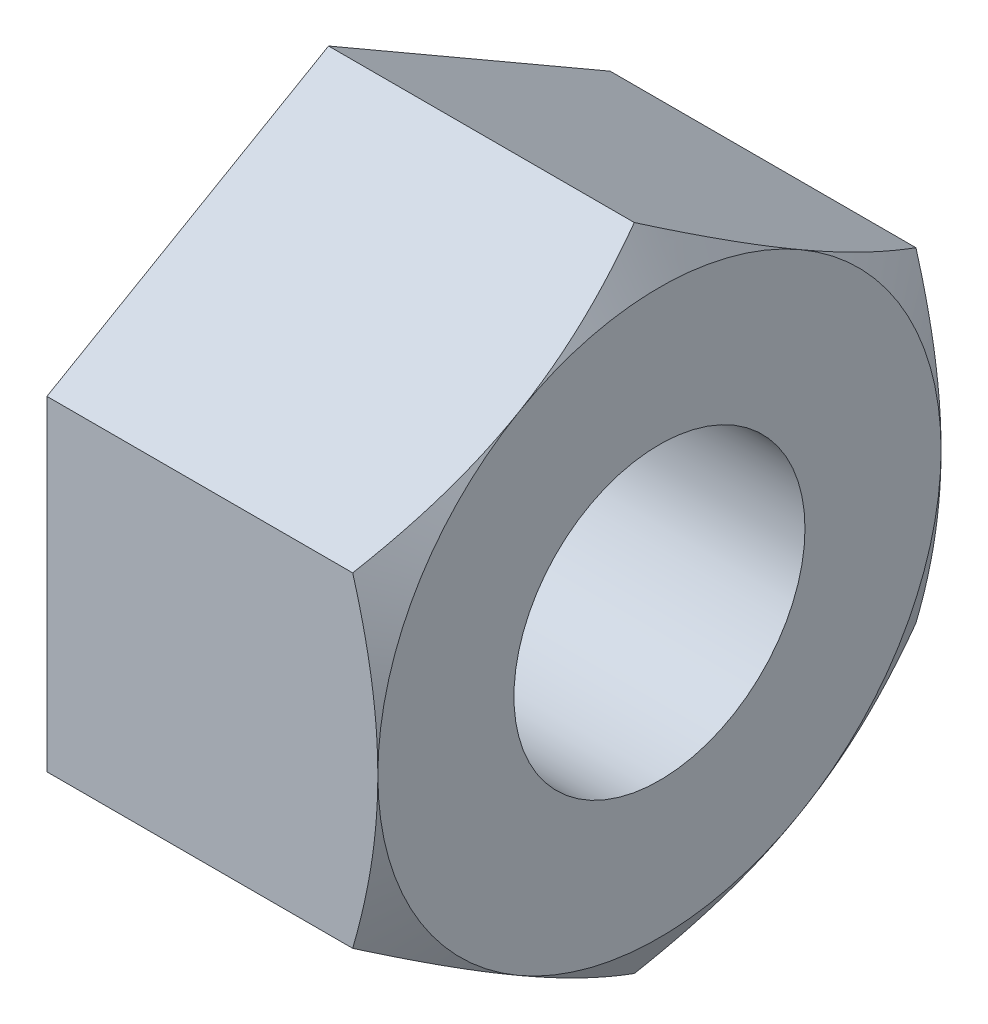
ISO-10303-21;
HEADER;
FILE_DESCRIPTION(('STEP AP214'),'2;1');
FILE_NAME('part.step','',(''),(''),'','','');
FILE_SCHEMA(('AUTOMOTIVE_DESIGN { 1 0 10303 214 1 1 1 1 }'));
ENDSEC;
DATA;
#1=APPLICATION_CONTEXT('core data for automotive mechanical design processes');
#2=APPLICATION_PROTOCOL_DEFINITION('international standard','automotive_design',2000,#1);
#3=PRODUCT_CONTEXT('',#1,'mechanical');
#4=PRODUCT('Part','Part','',(#3));
#5=PRODUCT_RELATED_PRODUCT_CATEGORY('part','',(#4));
#6=PRODUCT_DEFINITION_FORMATION('','',#4);
#7=PRODUCT_DEFINITION_CONTEXT('part definition',#1,'design');
#8=PRODUCT_DEFINITION('design','',#6,#7);
#9=PRODUCT_DEFINITION_SHAPE('','',#8);
#10=(LENGTH_UNIT() NAMED_UNIT(*) SI_UNIT(.MILLI.,.METRE.));
#11=(NAMED_UNIT(*) PLANE_ANGLE_UNIT() SI_UNIT($,.RADIAN.));
#12=(NAMED_UNIT(*) SI_UNIT($,.STERADIAN.) SOLID_ANGLE_UNIT());
#13=UNCERTAINTY_MEASURE_WITH_UNIT(LENGTH_MEASURE(1.E-05),#10,'distance_accuracy_value','');
#14=(GEOMETRIC_REPRESENTATION_CONTEXT(3) GLOBAL_UNCERTAINTY_ASSIGNED_CONTEXT((#13)) GLOBAL_UNIT_ASSIGNED_CONTEXT((#10,
#11,#12)) REPRESENTATION_CONTEXT('',''));
#15=CARTESIAN_POINT('',(0.,0.,0.));
#16=DIRECTION('',(0.,0.,1.));
#17=DIRECTION('',(1.,0.,0.));
#18=AXIS2_PLACEMENT_3D('',#15,#16,#17);
#19=CARTESIAN_POINT('',(-4.7,2.30940107675851,-4.));
#20=DIRECTION('',(0.,0.866025403784439,-0.5));
#21=DIRECTION('',(0.,0.5,0.866025403784439));
#22=AXIS2_PLACEMENT_3D('',#19,#20,#21);
#23=PLANE('',#22);
#24=DIRECTION('',(1.,0.,0.));
#25=VECTOR('',#24,1.);
#26=CARTESIAN_POINT('',(-4.7,4.61880215351701,0.));
#27=LINE('',#26,#25);
#28=CARTESIAN_POINT('',(-4.7,4.61880215351701,0.));
#29=VERTEX_POINT('',#28);
#30=CARTESIAN_POINT('',(-0.35726558990816,4.61880215351701,0.));
#31=VERTEX_POINT('',#30);
#32=EDGE_CURVE('E213',#29,#31,#27,.T.);
#33=ORIENTED_EDGE('',*,*,#32,.T.);
#34=CARTESIAN_POINT('',(-0.357332259074764,4.61891762357085,0.000199999999999586));
#35=CARTESIAN_POINT('',(-0.298717873648281,4.51743148381381,-0.175579150323228));
#36=CARTESIAN_POINT('',(-0.245410321462261,4.41506932144052,-0.352875616326381));
#37=CARTESIAN_POINT('',(-0.152361670746403,4.2085725054774,-0.710538593175706));
#38=CARTESIAN_POINT('',(-0.112653489029704,4.10443418285647,-0.890911458970151));
#39=CARTESIAN_POINT('',(-0.0508422152802794,3.89744813015756,-1.24942181870279));
#40=CARTESIAN_POINT('',(-0.0283277315228894,3.7946322465506,-1.42750415293514));
#41=CARTESIAN_POINT('',(-0.00145062314658247,3.58851671999023,-1.78450671716651));
#42=CARTESIAN_POINT('',(0.00293425857305625,3.48521782616117,-1.9634256496441));
#43=CARTESIAN_POINT('',(-0.00619007293997059,3.29219970504619,-2.29774284219673));
#44=CARTESIAN_POINT('',(-0.0174589539879945,3.20245157692487,-2.45319115998707));
#45=CARTESIAN_POINT('',(-0.0531739907981929,3.02354002635497,-2.76307505563505));
#46=CARTESIAN_POINT('',(-0.0776323457115324,2.93437722268073,-2.91750956174413));
#47=CARTESIAN_POINT('',(-0.138776064919288,2.75509682012354,-3.22803232777458));
#48=CARTESIAN_POINT('',(-0.175720603654862,2.6650019108942,-3.3840812880631));
#49=CARTESIAN_POINT('',(-0.259570072548025,2.48615580200001,-3.69385183540384));
#50=CARTESIAN_POINT('',(-0.306455302212737,2.39740231122585,-3.84757739077378));
#51=CARTESIAN_POINT('',(-0.357332259074764,2.30928560670467,-4.0002));
#52=B_SPLINE_CURVE_WITH_KNOTS('',3,(#34,#35,#36,#37,#38,#39,#40,#41,#42,#43,#44,#45,#46,#47,#48,
#49,#50,#51),.UNSPECIFIED.,.F.,.F.,(4,2,2,2,2,2,2,2,4),(0.,0.634047835695965,1.26961969224543,
1.88946157213122,2.50854226669297,3.04757825393385,3.58711366126903,4.13861653143764,
4.68903648037743),.UNSPECIFIED.);
#53=CARTESIAN_POINT('',(0.,3.46410161513775,-2.));
#54=VERTEX_POINT('',#53);
#55=EDGE_CURVE('E58',#31,#54,#52,.T.);
#56=ORIENTED_EDGE('',*,*,#55,.T.);
#57=CARTESIAN_POINT('',(-0.35726558990816,2.30940107675851,-4.));
#58=VERTEX_POINT('',#57);
#59=EDGE_CURVE('E185',#54,#58,#52,.T.);
#60=ORIENTED_EDGE('',*,*,#59,.T.);
#61=DIRECTION('',(1.,0.,0.));
#62=VECTOR('',#61,1.);
#63=CARTESIAN_POINT('',(-4.7,2.30940107675851,-4.));
#64=LINE('',#63,#62);
#65=CARTESIAN_POINT('',(-4.7,2.30940107675851,-4.));
#66=VERTEX_POINT('',#65);
#67=EDGE_CURVE('E233',#66,#58,#64,.T.);
#68=ORIENTED_EDGE('',*,*,#67,.F.);
#69=DIRECTION('',(0.,0.5,0.866025403784439));
#70=VECTOR('',#69,1.);
#71=CARTESIAN_POINT('',(-4.7,2.30940107675851,-4.));
#72=LINE('',#71,#70);
#73=EDGE_CURVE('E216',#66,#29,#72,.T.);
#74=ORIENTED_EDGE('',*,*,#73,.T.);
#75=EDGE_LOOP('',(#33,#56,#60,#68,#74));
#76=FACE_BOUND('',#75,.T.);
#77=ADVANCED_FACE('F36',(#76),#23,.T.);
#78=CARTESIAN_POINT('',(-4.7,-2.3094010767585,-4.));
#79=DIRECTION('',(0.,0.,-1.));
#80=DIRECTION('',(-1.,0.,0.));
#81=AXIS2_PLACEMENT_3D('',#78,#79,#80);
#82=PLANE('',#81);
#83=ORIENTED_EDGE('',*,*,#67,.T.);
#84=CARTESIAN_POINT('',(-1.91410682124061,-6.12487198995892,-4.));
#85=CARTESIAN_POINT('',(-1.82923627076687,-5.94924937038676,-4.));
#86=CARTESIAN_POINT('',(-1.74520940380737,-5.77321152095286,-4.));
#87=CARTESIAN_POINT('',(-1.57932514679714,-5.42008084777954,-4.));
#88=CARTESIAN_POINT('',(-1.49746813236721,-5.24298784779927,-4.));
#89=CARTESIAN_POINT('',(-1.33597446305854,-4.88656571686333,-4.));
#90=CARTESIAN_POINT('',(-1.25635319506302,-4.70722958889362,-4.));
#91=CARTESIAN_POINT('',(-1.10053058542028,-4.34708334747263,-4.));
#92=CARTESIAN_POINT('',(-1.024329065508,-4.16627331143537,-4.));
#93=CARTESIAN_POINT('',(-0.875350650394347,-3.80064706744977,-4.));
#94=CARTESIAN_POINT('',(-0.802627284215832,-3.61580892822769,-4.));
#95=CARTESIAN_POINT('',(-0.662876230959408,-3.24395246794968,-4.));
#96=CARTESIAN_POINT('',(-0.595849177566493,-3.05693390695801,-4.));
#97=CARTESIAN_POINT('',(-0.469291748430873,-2.6808031825377,-4.));
#98=CARTESIAN_POINT('',(-0.40974543478383,-2.49169643712848,-4.));
#99=CARTESIAN_POINT('',(-0.300083356544501,-2.11079454635851,-4.));
#100=CARTESIAN_POINT('',(-0.249964609676747,-1.91900027185748,-4.));
#101=CARTESIAN_POINT('',(-0.161590794954039,-1.532592326982,-4.));
#102=CARTESIAN_POINT('',(-0.123338885956538,-1.33797792031649,-4.));
#103=CARTESIAN_POINT('',(-0.0612742359223421,-0.946402725872551,-4.));
#104=CARTESIAN_POINT('',(-0.037461507651698,-0.749441936019772,-4.));
#105=CARTESIAN_POINT('',(-0.00638181314943593,-0.355451989627941,-4.));
#106=CARTESIAN_POINT('',(0.000989900761041437,-0.15843131109401,-4.));
#107=CARTESIAN_POINT('',(-0.00120406637479564,0.235472085607468,-4.));
#108=CARTESIAN_POINT('',(-0.0107653508153506,0.432354826312204,-4.));
#109=CARTESIAN_POINT('',(-0.0408787346135902,0.768560635225518,-4.));
#110=CARTESIAN_POINT('',(-0.0575092960439092,0.908254618381823,-4.));
#111=CARTESIAN_POINT('',(-0.0982134103466918,1.18656349063498,-4.));
#112=CARTESIAN_POINT('',(-0.122288137058447,1.32517820601014,-4.));
#113=CARTESIAN_POINT('',(-0.204415070950233,1.73929045452971,-4.));
#114=CARTESIAN_POINT('',(-0.272348886425156,2.01284690528725,-4.));
#115=CARTESIAN_POINT('',(-0.389516359317208,2.42218253014527,-4.));
#116=CARTESIAN_POINT('',(-0.431713941811642,2.56009536361542,-4.));
#117=CARTESIAN_POINT('',(-0.520284580227769,2.83448159101408,-4.));
#118=CARTESIAN_POINT('',(-0.56665475618692,2.97095590623562,-4.));
#119=CARTESIAN_POINT('',(-0.662605699180295,3.24189440516346,-4.));
#120=CARTESIAN_POINT('',(-0.71216692575351,3.37636557946843,-4.));
#121=CARTESIAN_POINT('',(-0.814198353790713,3.6442646115292,-4.));
#122=CARTESIAN_POINT('',(-0.866669730963381,3.77769202239393,-4.));
#123=CARTESIAN_POINT('',(-0.920309006541805,3.9106369898669,-4.));
#124=B_SPLINE_CURVE_WITH_KNOTS('',3,(#84,#85,#86,#87,#88,#89,#90,#91,#92,#93,#94,#95,#96,#97,
#98,#99,#100,#101,#102,#103,#104,#105,#106,#107,#108,#109,#110,#111,#112,#113,#114,#115,#116,
#117,#118,#119,#120,#121,#122,#123),.UNSPECIFIED.,.F.,.F.,(4,2,2,2,2,2,2,2,2,2,2,2,2,2,2,2,2,2,
2,4),(0.,0.585171792532269,1.17044423059926,1.75906594645989,2.34765694284826,2.94347400997483,
3.53935727210688,4.13394864697599,4.7283516139147,5.32291267067844,5.91747425310811,
6.50823685854035,7.09884609659885,7.5206814082552,7.94258327130839,8.78701491359831,
9.21965281897692,9.65199437116301,10.0819024146297,10.5119854255247),.UNSPECIFIED.);
#125=CARTESIAN_POINT('',(0.,0.,-4.));
#126=VERTEX_POINT('',#125);
#127=EDGE_CURVE('E183',#58,#126,#124,.F.);
#128=ORIENTED_EDGE('',*,*,#127,.T.);
#129=CARTESIAN_POINT('',(-0.35726558990816,-2.3094010767585,-4.));
#130=VERTEX_POINT('',#129);
#131=EDGE_CURVE('E177',#126,#130,#124,.F.);
#132=ORIENTED_EDGE('',*,*,#131,.T.);
#133=DIRECTION('',(1.,0.,0.));
#134=VECTOR('',#133,1.);
#135=CARTESIAN_POINT('',(-4.7,-2.3094010767585,-4.));
#136=LINE('',#135,#134);
#137=CARTESIAN_POINT('',(-4.7,-2.3094010767585,-4.));
#138=VERTEX_POINT('',#137);
#139=EDGE_CURVE('E230',#138,#130,#136,.T.);
#140=ORIENTED_EDGE('',*,*,#139,.F.);
#141=DIRECTION('',(0.,1.,0.));
#142=VECTOR('',#141,1.);
#143=CARTESIAN_POINT('',(-4.7,-2.3094010767585,-4.));
#144=LINE('',#143,#142);
#145=EDGE_CURVE('E221',#138,#66,#144,.T.);
#146=ORIENTED_EDGE('',*,*,#145,.T.);
#147=EDGE_LOOP('',(#83,#128,#132,#140,#146));
#148=FACE_BOUND('',#147,.T.);
#149=ADVANCED_FACE('F190',(#148),#82,.T.);
#150=CARTESIAN_POINT('',(-4.7,-4.618802153517,0.));
#151=DIRECTION('',(0.,-0.866025403784439,-0.5));
#152=DIRECTION('',(0.,0.5,-0.866025403784439));
#153=AXIS2_PLACEMENT_3D('',#150,#151,#152);
#154=PLANE('',#153);
#155=ORIENTED_EDGE('',*,*,#139,.T.);
#156=CARTESIAN_POINT('',(-0.357332259074763,-2.30928560670467,-4.0002));
#157=CARTESIAN_POINT('',(-0.298717873648279,-2.4107717464617,-3.82442084967677));
#158=CARTESIAN_POINT('',(-0.245410321462259,-2.51313390883499,-3.64712438367362));
#159=CARTESIAN_POINT('',(-0.152361670746401,-2.71963072479811,-3.28946140682429));
#160=CARTESIAN_POINT('',(-0.112653489029703,-2.82376904741904,-3.10908854102985));
#161=CARTESIAN_POINT('',(-0.0508422152802778,-3.03075510011795,-2.75057818129721));
#162=CARTESIAN_POINT('',(-0.0283277315228873,-3.13357098372491,-2.57249584706486));
#163=CARTESIAN_POINT('',(-0.00145062314658024,-3.33968651028528,-2.21549328283349));
#164=CARTESIAN_POINT('',(0.00293425857305818,-3.44298540411434,-2.0365743503559));
#165=CARTESIAN_POINT('',(-0.00619007293996871,-3.63600352522932,-1.70225715780327));
#166=CARTESIAN_POINT('',(-0.0174589539879924,-3.72575165335064,-1.54680884001294));
#167=CARTESIAN_POINT('',(-0.0531739907981908,-3.90466320392054,-1.23692494436495));
#168=CARTESIAN_POINT('',(-0.0776323457115303,-3.99382600759478,-1.08249043825587));
#169=CARTESIAN_POINT('',(-0.138776064919286,-4.17310641015197,-0.771967672225422));
#170=CARTESIAN_POINT('',(-0.17572060365486,-4.26320131938131,-0.615918711936898));
#171=CARTESIAN_POINT('',(-0.259570072548023,-4.4420474282755,-0.30614816459616));
#172=CARTESIAN_POINT('',(-0.306455302212736,-4.53080091904966,-0.15242260922622));
#173=CARTESIAN_POINT('',(-0.357332259074762,-4.61891762357084,0.000200000000000714));
#174=B_SPLINE_CURVE_WITH_KNOTS('',3,(#156,#157,#158,#159,#160,#161,#162,#163,#164,#165,#166,
#167,#168,#169,#170,#171,#172,#173),.UNSPECIFIED.,.F.,.F.,(4,2,2,2,2,2,2,2,4),(0.,
0.634047835695965,1.26961969224543,1.88946157213122,2.50854226669297,3.04757825393385,
3.58711366126903,4.13861653143764,4.68903648037743),.UNSPECIFIED.);
#175=CARTESIAN_POINT('',(0.,-3.46410161513776,-2.));
#176=VERTEX_POINT('',#175);
#177=EDGE_CURVE('E184',#130,#176,#174,.T.);
#178=ORIENTED_EDGE('',*,*,#177,.T.);
#179=CARTESIAN_POINT('',(-0.35726558990816,-4.61880215351701,0.));
#180=VERTEX_POINT('',#179);
#181=EDGE_CURVE('E171',#176,#180,#174,.T.);
#182=ORIENTED_EDGE('',*,*,#181,.T.);
#183=DIRECTION('',(1.,0.,0.));
#184=VECTOR('',#183,1.);
#185=CARTESIAN_POINT('',(-4.7,-4.618802153517,0.));
#186=LINE('',#185,#184);
#187=CARTESIAN_POINT('',(-4.7,-4.618802153517,0.));
#188=VERTEX_POINT('',#187);
#189=EDGE_CURVE('E228',#188,#180,#186,.T.);
#190=ORIENTED_EDGE('',*,*,#189,.F.);
#191=DIRECTION('',(0.,0.5,-0.866025403784439));
#192=VECTOR('',#191,1.);
#193=CARTESIAN_POINT('',(-4.7,-4.618802153517,0.));
#194=LINE('',#193,#192);
#195=EDGE_CURVE('E224',#188,#138,#194,.T.);
#196=ORIENTED_EDGE('',*,*,#195,.T.);
#197=EDGE_LOOP('',(#155,#178,#182,#190,#196));
#198=FACE_BOUND('',#197,.T.);
#199=ADVANCED_FACE('F193',(#198),#154,.T.);
#200=CARTESIAN_POINT('',(-4.7,-2.3094010767585,4.));
#201=DIRECTION('',(0.,-0.866025403784439,0.5));
#202=DIRECTION('',(0.,-0.5,-0.866025403784439));
#203=AXIS2_PLACEMENT_3D('',#200,#201,#202);
#204=PLANE('',#203);
#205=ORIENTED_EDGE('',*,*,#189,.T.);
#206=CARTESIAN_POINT('',(-0.357332259074762,-4.61891762357084,-0.000199999999999108));
#207=CARTESIAN_POINT('',(-0.298717873648278,-4.5174314838138,0.175579150323229));
#208=CARTESIAN_POINT('',(-0.245410321462259,-4.41506932144051,0.352875616326381));
#209=CARTESIAN_POINT('',(-0.152361670746401,-4.20857250547739,0.710538593175706));
#210=CARTESIAN_POINT('',(-0.112653489029702,-4.10443418285647,0.89091145897015));
#211=CARTESIAN_POINT('',(-0.0508422152802772,-3.89744813015756,1.24942181870279));
#212=CARTESIAN_POINT('',(-0.0283277315228871,-3.79463224655059,1.42750415293514));
#213=CARTESIAN_POINT('',(-0.00145062314658032,-3.58851671999023,1.78450671716651));
#214=CARTESIAN_POINT('',(0.00293425857305808,-3.48521782616117,1.9634256496441));
#215=CARTESIAN_POINT('',(-0.0061900729399688,-3.29219970504619,2.29774284219673));
#216=CARTESIAN_POINT('',(-0.0174589539879925,-3.20245157692486,2.45319115998706));
#217=CARTESIAN_POINT('',(-0.0531739907981908,-3.02354002635497,2.76307505563505));
#218=CARTESIAN_POINT('',(-0.0776323457115303,-2.93437722268072,2.91750956174413));
#219=CARTESIAN_POINT('',(-0.138776064919286,-2.75509682012354,3.22803232777458));
#220=CARTESIAN_POINT('',(-0.17572060365486,-2.6650019108942,3.3840812880631));
#221=CARTESIAN_POINT('',(-0.259570072548023,-2.486155802,3.69385183540384));
#222=CARTESIAN_POINT('',(-0.306455302212736,-2.39740231122585,3.84757739077378));
#223=CARTESIAN_POINT('',(-0.357332259074762,-2.30928560670466,4.0002));
#224=B_SPLINE_CURVE_WITH_KNOTS('',3,(#206,#207,#208,#209,#210,#211,#212,#213,#214,#215,#216,
#217,#218,#219,#220,#221,#222,#223),.UNSPECIFIED.,.F.,.F.,(4,2,2,2,2,2,2,2,4),(0.,
0.634047835695965,1.26961969224543,1.88946157213122,2.50854226669297,3.04757825393385,
3.58711366126903,4.13861653143763,4.68903648037743),.UNSPECIFIED.);
#225=CARTESIAN_POINT('',(0.,-3.46410161513775,2.));
#226=VERTEX_POINT('',#225);
#227=EDGE_CURVE('E140',#180,#226,#224,.T.);
#228=ORIENTED_EDGE('',*,*,#227,.T.);
#229=CARTESIAN_POINT('',(-0.35726558990816,-2.30940107675851,4.));
#230=VERTEX_POINT('',#229);
#231=EDGE_CURVE('E125',#226,#230,#224,.T.);
#232=ORIENTED_EDGE('',*,*,#231,.T.);
#233=DIRECTION('',(1.,0.,0.));
#234=VECTOR('',#233,1.);
#235=CARTESIAN_POINT('',(-4.7,-2.3094010767585,4.));
#236=LINE('',#235,#234);
#237=CARTESIAN_POINT('',(-4.7,-2.3094010767585,4.));
#238=VERTEX_POINT('',#237);
#239=EDGE_CURVE('E139',#238,#230,#236,.T.);
#240=ORIENTED_EDGE('',*,*,#239,.F.);
#241=DIRECTION('',(0.,-0.5,-0.866025403784438));
#242=VECTOR('',#241,1.);
#243=CARTESIAN_POINT('',(-4.7,-2.3094010767585,4.));
#244=LINE('',#243,#242);
#245=EDGE_CURVE('E238',#238,#188,#244,.T.);
#246=ORIENTED_EDGE('',*,*,#245,.T.);
#247=EDGE_LOOP('',(#205,#228,#232,#240,#246));
#248=FACE_BOUND('',#247,.T.);
#249=ADVANCED_FACE('F197',(#248),#204,.T.);
#250=CARTESIAN_POINT('',(-4.7,2.30940107675851,4.));
#251=DIRECTION('',(0.,0.,1.));
#252=DIRECTION('',(1.,0.,0.));
#253=AXIS2_PLACEMENT_3D('',#250,#251,#252);
#254=PLANE('',#253);
#255=ORIENTED_EDGE('',*,*,#239,.T.);
#256=CARTESIAN_POINT('',(-1.91410682124061,-6.12487198995891,4.));
#257=CARTESIAN_POINT('',(-1.82923627076687,-5.94924937038676,4.));
#258=CARTESIAN_POINT('',(-1.74520940380737,-5.77321152095285,4.));
#259=CARTESIAN_POINT('',(-1.57932514679714,-5.42008084777954,4.));
#260=CARTESIAN_POINT('',(-1.49746813236721,-5.24298784779927,4.));
#261=CARTESIAN_POINT('',(-1.33597446305853,-4.88656571686333,4.));
#262=CARTESIAN_POINT('',(-1.25635319506302,-4.70722958889361,4.));
#263=CARTESIAN_POINT('',(-1.10053058542028,-4.34708334747262,4.));
#264=CARTESIAN_POINT('',(-1.024329065508,-4.16627331143537,4.));
#265=CARTESIAN_POINT('',(-0.875350650394346,-3.80064706744977,4.));
#266=CARTESIAN_POINT('',(-0.80262728421583,-3.61580892822769,4.));
#267=CARTESIAN_POINT('',(-0.662876230959407,-3.24395246794968,4.));
#268=CARTESIAN_POINT('',(-0.595849177566492,-3.056933906958,4.));
#269=CARTESIAN_POINT('',(-0.469291748430872,-2.6808031825377,4.));
#270=CARTESIAN_POINT('',(-0.409745434783829,-2.49169643712848,4.));
#271=CARTESIAN_POINT('',(-0.3000833565445,-2.1107945463585,4.));
#272=CARTESIAN_POINT('',(-0.249964609676747,-1.91900027185748,4.));
#273=CARTESIAN_POINT('',(-0.161590794954038,-1.53259232698199,4.));
#274=CARTESIAN_POINT('',(-0.123338885956537,-1.33797792031649,4.));
#275=CARTESIAN_POINT('',(-0.0612742359223415,-0.946402725872549,4.));
#276=CARTESIAN_POINT('',(-0.0374615076516973,-0.74944193601977,4.));
#277=CARTESIAN_POINT('',(-0.00638181314943556,-0.35545198962794,4.));
#278=CARTESIAN_POINT('',(0.00098990076104152,-0.158431311094009,4.));
#279=CARTESIAN_POINT('',(-0.00120406637479566,0.235472085607469,4.));
#280=CARTESIAN_POINT('',(-0.0107653508153505,0.432354826312206,4.));
#281=CARTESIAN_POINT('',(-0.0408787346135903,0.768560635225519,4.));
#282=CARTESIAN_POINT('',(-0.0575092960439096,0.908254618381825,4.));
#283=CARTESIAN_POINT('',(-0.0982134103466924,1.18656349063498,4.));
#284=CARTESIAN_POINT('',(-0.122288137058447,1.32517820601015,4.));
#285=CARTESIAN_POINT('',(-0.204415070950233,1.73929045452971,4.));
#286=CARTESIAN_POINT('',(-0.272348886425157,2.01284690528725,4.));
#287=CARTESIAN_POINT('',(-0.389516359317209,2.42218253014527,4.));
#288=CARTESIAN_POINT('',(-0.431713941811642,2.56009536361542,4.));
#289=CARTESIAN_POINT('',(-0.52028458022777,2.83448159101408,4.));
#290=CARTESIAN_POINT('',(-0.566654756186921,2.97095590623562,4.));
#291=CARTESIAN_POINT('',(-0.662605699180297,3.24189440516346,4.));
#292=CARTESIAN_POINT('',(-0.712166925753511,3.37636557946844,4.));
#293=CARTESIAN_POINT('',(-0.814198353790714,3.6442646115292,4.));
#294=CARTESIAN_POINT('',(-0.866669730963382,3.77769202239393,4.));
#295=CARTESIAN_POINT('',(-0.920309006541806,3.91063698986691,4.));
#296=B_SPLINE_CURVE_WITH_KNOTS('',3,(#256,#257,#258,#259,#260,#261,#262,#263,#264,#265,#266,
#267,#268,#269,#270,#271,#272,#273,#274,#275,#276,#277,#278,#279,#280,#281,#282,#283,#284,#285,
#286,#287,#288,#289,#290,#291,#292,#293,#294,#295),.UNSPECIFIED.,.F.,.F.,(4,2,2,2,2,2,2,2,2,2,2,
2,2,2,2,2,2,2,2,4),(0.,0.58517179253227,1.17044423059927,1.75906594645989,2.34765694284826,
2.94347400997483,3.53935727210688,4.133948646976,4.7283516139147,5.32291267067844,
5.91747425310811,6.50823685854035,7.09884609659885,7.5206814082552,7.9425832713084,
8.78701491359831,9.21965281897692,9.65199437116301,10.0819024146297,10.5119854255247),.UNSPECIFIED.);
#297=CARTESIAN_POINT('',(0.,0.,4.));
#298=VERTEX_POINT('',#297);
#299=EDGE_CURVE('E118',#230,#298,#296,.T.);
#300=ORIENTED_EDGE('',*,*,#299,.T.);
#301=CARTESIAN_POINT('',(-0.35726558990816,2.30940107675851,4.));
#302=VERTEX_POINT('',#301);
#303=EDGE_CURVE('E107',#298,#302,#296,.T.);
#304=ORIENTED_EDGE('',*,*,#303,.T.);
#305=DIRECTION('',(1.,0.,0.));
#306=VECTOR('',#305,1.);
#307=CARTESIAN_POINT('',(-4.7,2.30940107675851,4.));
#308=LINE('',#307,#306);
#309=CARTESIAN_POINT('',(-4.7,2.30940107675851,4.));
#310=VERTEX_POINT('',#309);
#311=EDGE_CURVE('E220',#310,#302,#308,.T.);
#312=ORIENTED_EDGE('',*,*,#311,.F.);
#313=DIRECTION('',(0.,-1.,0.));
#314=VECTOR('',#313,1.);
#315=CARTESIAN_POINT('',(-4.7,2.30940107675851,4.));
#316=LINE('',#315,#314);
#317=EDGE_CURVE('E241',#310,#238,#316,.T.);
#318=ORIENTED_EDGE('',*,*,#317,.T.);
#319=EDGE_LOOP('',(#255,#300,#304,#312,#318));
#320=FACE_BOUND('',#319,.T.);
#321=ADVANCED_FACE('F137',(#320),#254,.T.);
#322=CARTESIAN_POINT('',(-4.7,4.61880215351701,0.));
#323=DIRECTION('',(0.,0.866025403784439,0.5));
#324=DIRECTION('',(0.,-0.5,0.866025403784439));
#325=AXIS2_PLACEMENT_3D('',#322,#323,#324);
#326=PLANE('',#325);
#327=ORIENTED_EDGE('',*,*,#311,.T.);
#328=CARTESIAN_POINT('',(-0.357332259074764,2.30928560670467,4.0002));
#329=CARTESIAN_POINT('',(-0.29871787364828,2.41077174646171,3.82442084967677));
#330=CARTESIAN_POINT('',(-0.24541032146226,2.513133908835,3.64712438367362));
#331=CARTESIAN_POINT('',(-0.152361670746402,2.71963072479812,3.28946140682429));
#332=CARTESIAN_POINT('',(-0.112653489029703,2.82376904741904,3.10908854102985));
#333=CARTESIAN_POINT('',(-0.0508422152802786,3.03075510011795,2.75057818129721));
#334=CARTESIAN_POINT('',(-0.0283277315228886,3.13357098372492,2.57249584706486));
#335=CARTESIAN_POINT('',(-0.00145062314658192,3.33968651028528,2.21549328283349));
#336=CARTESIAN_POINT('',(0.00293425857305665,3.44298540411434,2.0365743503559));
#337=CARTESIAN_POINT('',(-0.00619007293997016,3.63600352522932,1.70225715780327));
#338=CARTESIAN_POINT('',(-0.0174589539879939,3.72575165335065,1.54680884001293));
#339=CARTESIAN_POINT('',(-0.0531739907981927,3.90466320392054,1.23692494436494));
#340=CARTESIAN_POINT('',(-0.0776323457115327,3.99382600759479,1.08249043825587));
#341=CARTESIAN_POINT('',(-0.138776064919289,4.17310641015197,0.771967672225422));
#342=CARTESIAN_POINT('',(-0.175720603654862,4.26320131938131,0.615918711936898));
#343=CARTESIAN_POINT('',(-0.259570072548025,4.44204742827551,0.30614816459616));
#344=CARTESIAN_POINT('',(-0.306455302212737,4.53080091904966,0.15242260922622));
#345=CARTESIAN_POINT('',(-0.357332259074764,4.61891762357085,-0.000200000000000428));
#346=B_SPLINE_CURVE_WITH_KNOTS('',3,(#328,#329,#330,#331,#332,#333,#334,#335,#336,#337,#338,
#339,#340,#341,#342,#343,#344,#345),.UNSPECIFIED.,.F.,.F.,(4,2,2,2,2,2,2,2,4),(0.,
0.634047835695965,1.26961969224543,1.88946157213122,2.50854226669297,3.04757825393385,
3.58711366126903,4.13861653143764,4.68903648037743),.UNSPECIFIED.);
#347=CARTESIAN_POINT('',(0.,3.46410161513775,2.));
#348=VERTEX_POINT('',#347);
#349=EDGE_CURVE('E114',#302,#348,#346,.T.);
#350=ORIENTED_EDGE('',*,*,#349,.T.);
#351=EDGE_CURVE('E133',#348,#31,#346,.T.);
#352=ORIENTED_EDGE('',*,*,#351,.T.);
#353=ORIENTED_EDGE('',*,*,#32,.F.);
#354=DIRECTION('',(0.,-0.5,0.866025403784439));
#355=VECTOR('',#354,1.);
#356=CARTESIAN_POINT('',(-4.7,4.61880215351701,0.));
#357=LINE('',#356,#355);
#358=EDGE_CURVE('E243',#29,#310,#357,.T.);
#359=ORIENTED_EDGE('',*,*,#358,.T.);
#360=EDGE_LOOP('',(#327,#350,#352,#353,#359));
#361=FACE_BOUND('',#360,.T.);
#362=ADVANCED_FACE('F205',(#361),#326,.T.);
#363=CARTESIAN_POINT('',(-4.7,0.,0.));
#364=DIRECTION('',(1.,0.,0.));
#365=DIRECTION('',(0.,0.,-1.));
#366=AXIS2_PLACEMENT_3D('',#363,#364,#365);
#367=PLANE('',#366);
#368=CARTESIAN_POINT('',(-4.7,0.,0.));
#369=DIRECTION('',(1.,0.,0.));
#370=DIRECTION('',(0.,0.,-1.));
#371=AXIS2_PLACEMENT_3D('',#368,#369,#370);
#372=CIRCLE('',#371,2.067);
#373=CARTESIAN_POINT('',(-4.7,0.,-2.067));
#374=VERTEX_POINT('',#373);
#375=EDGE_CURVE('E134',#374,#374,#372,.T.);
#376=ORIENTED_EDGE('',*,*,#375,.T.);
#377=EDGE_LOOP('',(#376));
#378=FACE_BOUND('',#377,.T.);
#379=ORIENTED_EDGE('',*,*,#73,.F.);
#380=ORIENTED_EDGE('',*,*,#145,.F.);
#381=ORIENTED_EDGE('',*,*,#195,.F.);
#382=ORIENTED_EDGE('',*,*,#245,.F.);
#383=ORIENTED_EDGE('',*,*,#317,.F.);
#384=ORIENTED_EDGE('',*,*,#358,.F.);
#385=EDGE_LOOP('',(#379,#380,#381,#382,#383,#384));
#386=FACE_BOUND('',#385,.T.);
#387=ADVANCED_FACE('F163',(#378,#386),#367,.F.);
#388=CARTESIAN_POINT('',(-0.35726558990816,0.,0.));
#389=DIRECTION('',(-1.,0.,0.));
#390=DIRECTION('',(0.,0.,1.));
#391=AXIS2_PLACEMENT_3D('',#388,#389,#390);
#392=CONICAL_SURFACE('',#391,4.61880215351701,1.0471975511966);
#393=CARTESIAN_POINT('',(0.,0.,0.));
#394=DIRECTION('',(1.,0.,0.));
#395=DIRECTION('',(0.,0.,-1.));
#396=AXIS2_PLACEMENT_3D('',#393,#394,#395);
#397=CIRCLE('',#396,4.);
#398=EDGE_CURVE('E40',#176,#126,#397,.T.);
#399=ORIENTED_EDGE('',*,*,#398,.F.);
#400=ORIENTED_EDGE('',*,*,#177,.F.);
#401=ORIENTED_EDGE('',*,*,#131,.F.);
#402=EDGE_LOOP('',(#399,#400,#401));
#403=FACE_BOUND('',#402,.T.);
#404=ADVANCED_FACE('F249',(#403),#392,.T.);
#405=EDGE_CURVE('E130',#226,#176,#397,.T.);
#406=ORIENTED_EDGE('',*,*,#405,.F.);
#407=ORIENTED_EDGE('',*,*,#227,.F.);
#408=ORIENTED_EDGE('',*,*,#181,.F.);
#409=EDGE_LOOP('',(#406,#407,#408));
#410=FACE_BOUND('',#409,.T.);
#411=ADVANCED_FACE('F252',(#410),#392,.T.);
#412=EDGE_CURVE('E122',#298,#226,#397,.T.);
#413=ORIENTED_EDGE('',*,*,#412,.F.);
#414=ORIENTED_EDGE('',*,*,#299,.F.);
#415=ORIENTED_EDGE('',*,*,#231,.F.);
#416=EDGE_LOOP('',(#413,#414,#415));
#417=FACE_BOUND('',#416,.T.);
#418=ADVANCED_FACE('F123',(#417),#392,.T.);
#419=CARTESIAN_POINT('',(0.,0.,0.));
#420=DIRECTION('',(-1.,0.,0.));
#421=DIRECTION('',(0.,0.,1.));
#422=AXIS2_PLACEMENT_3D('',#419,#420,#421);
#423=CIRCLE('',#422,4.);
#424=EDGE_CURVE('E111',#298,#348,#423,.T.);
#425=ORIENTED_EDGE('',*,*,#424,.T.);
#426=ORIENTED_EDGE('',*,*,#349,.F.);
#427=ORIENTED_EDGE('',*,*,#303,.F.);
#428=EDGE_LOOP('',(#425,#426,#427));
#429=FACE_BOUND('',#428,.T.);
#430=ADVANCED_FACE('F109',(#429),#392,.T.);
#431=ORIENTED_EDGE('',*,*,#351,.F.);
#432=EDGE_CURVE('E45',#54,#348,#397,.T.);
#433=ORIENTED_EDGE('',*,*,#432,.F.);
#434=ORIENTED_EDGE('',*,*,#55,.F.);
#435=EDGE_LOOP('',(#431,#433,#434));
#436=FACE_BOUND('',#435,.T.);
#437=ADVANCED_FACE('F161',(#436),#392,.T.);
#438=EDGE_CURVE('E11',#126,#54,#397,.T.);
#439=ORIENTED_EDGE('',*,*,#438,.F.);
#440=ORIENTED_EDGE('',*,*,#127,.F.);
#441=ORIENTED_EDGE('',*,*,#59,.F.);
#442=EDGE_LOOP('',(#439,#440,#441));
#443=FACE_BOUND('',#442,.T.);
#444=ADVANCED_FACE('F245',(#443),#392,.T.);
#445=CARTESIAN_POINT('',(0.,0.,0.));
#446=DIRECTION('',(1.,0.,0.));
#447=DIRECTION('',(0.,0.,-1.));
#448=AXIS2_PLACEMENT_3D('',#445,#446,#447);
#449=PLANE('',#448);
#450=CARTESIAN_POINT('',(0.,0.,0.));
#451=DIRECTION('',(1.,0.,0.));
#452=DIRECTION('',(0.,0.,-1.));
#453=AXIS2_PLACEMENT_3D('',#450,#451,#452);
#454=CIRCLE('',#453,2.067);
#455=CARTESIAN_POINT('',(0.,0.,-2.067));
#456=VERTEX_POINT('',#455);
#457=EDGE_CURVE('E373',#456,#456,#454,.T.);
#458=ORIENTED_EDGE('',*,*,#457,.F.);
#459=EDGE_LOOP('',(#458));
#460=FACE_BOUND('',#459,.T.);
#461=ORIENTED_EDGE('',*,*,#398,.T.);
#462=ORIENTED_EDGE('',*,*,#438,.T.);
#463=ORIENTED_EDGE('',*,*,#432,.T.);
#464=ORIENTED_EDGE('',*,*,#424,.F.);
#465=ORIENTED_EDGE('',*,*,#412,.T.);
#466=ORIENTED_EDGE('',*,*,#405,.T.);
#467=EDGE_LOOP('',(#461,#462,#463,#464,#465,#466));
#468=FACE_BOUND('',#467,.T.);
#469=ADVANCED_FACE('F132',(#460,#468),#449,.T.);
#470=CARTESIAN_POINT('',(0.,0.,0.));
#471=DIRECTION('',(1.,0.,0.));
#472=DIRECTION('',(0.,0.,-1.));
#473=AXIS2_PLACEMENT_3D('',#470,#471,#472);
#474=CYLINDRICAL_SURFACE('',#473,2.067);
#475=ORIENTED_EDGE('',*,*,#375,.F.);
#476=EDGE_LOOP('',(#475));
#477=FACE_BOUND('',#476,.T.);
#478=ORIENTED_EDGE('',*,*,#457,.T.);
#479=EDGE_LOOP('',(#478));
#480=FACE_BOUND('',#479,.T.);
#481=ADVANCED_FACE('F162',(#477,#480),#474,.F.);
#482=CLOSED_SHELL('',(#77,#149,#199,#249,#321,#362,#387,#404,#411,#418,#430,#437,#444,#469,#481));
#483=MANIFOLD_SOLID_BREP('B2',#482);
#484=ADVANCED_BREP_SHAPE_REPRESENTATION('',(#18,#483),#14);
#485=SHAPE_DEFINITION_REPRESENTATION(#9,#484);
ENDSEC;
END-ISO-10303-21;
